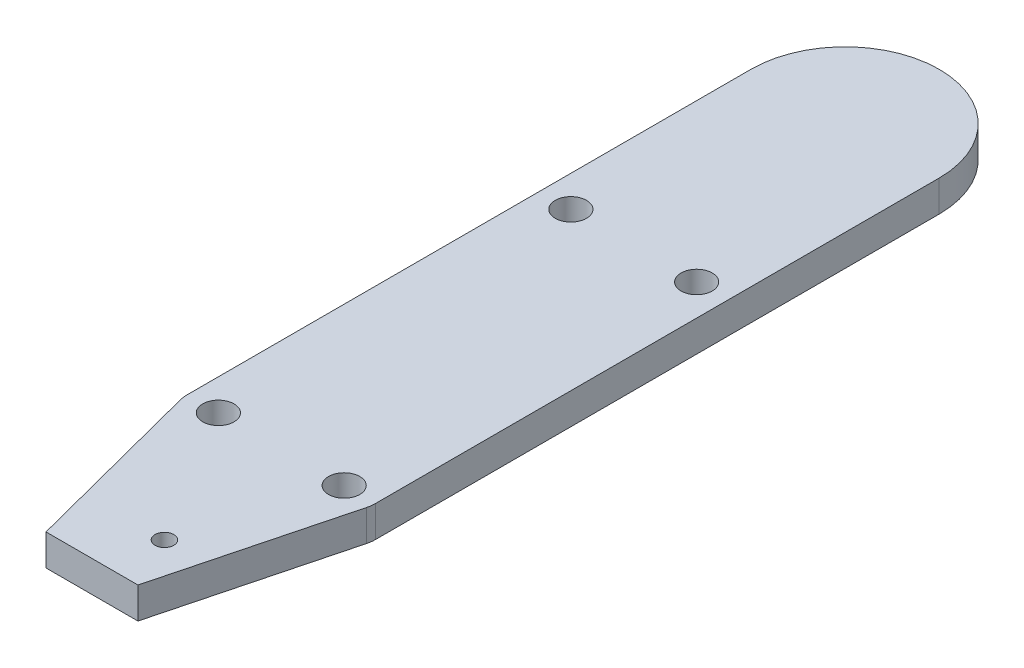
ISO-10303-21;
HEADER;
FILE_DESCRIPTION(('STEP AP214'),'2;1');
FILE_NAME('part.step','',(''),(''),'','','');
FILE_SCHEMA(('AUTOMOTIVE_DESIGN { 1 0 10303 214 1 1 1 1 }'));
ENDSEC;
DATA;
#1=APPLICATION_CONTEXT('core data for automotive mechanical design processes');
#2=APPLICATION_PROTOCOL_DEFINITION('international standard','automotive_design',2000,#1);
#3=PRODUCT_CONTEXT('',#1,'mechanical');
#4=PRODUCT('Part','Part','',(#3));
#5=PRODUCT_RELATED_PRODUCT_CATEGORY('part','',(#4));
#6=PRODUCT_DEFINITION_FORMATION('','',#4);
#7=PRODUCT_DEFINITION_CONTEXT('part definition',#1,'design');
#8=PRODUCT_DEFINITION('design','',#6,#7);
#9=PRODUCT_DEFINITION_SHAPE('','',#8);
#10=(LENGTH_UNIT() NAMED_UNIT(*) SI_UNIT(.MILLI.,.METRE.));
#11=(NAMED_UNIT(*) PLANE_ANGLE_UNIT() SI_UNIT($,.RADIAN.));
#12=(NAMED_UNIT(*) SI_UNIT($,.STERADIAN.) SOLID_ANGLE_UNIT());
#13=UNCERTAINTY_MEASURE_WITH_UNIT(LENGTH_MEASURE(1.E-05),#10,'distance_accuracy_value','');
#14=(GEOMETRIC_REPRESENTATION_CONTEXT(3) GLOBAL_UNCERTAINTY_ASSIGNED_CONTEXT((#13)) GLOBAL_UNIT_ASSIGNED_CONTEXT((#10,
#11,#12)) REPRESENTATION_CONTEXT('',''));
#15=CARTESIAN_POINT('',(0.,0.,0.));
#16=DIRECTION('',(0.,0.,1.));
#17=DIRECTION('',(1.,0.,0.));
#18=AXIS2_PLACEMENT_3D('',#15,#16,#17);
#19=CARTESIAN_POINT('',(25.1286787233292,5.,-29.7843357814116));
#20=DIRECTION('',(0.,1.,0.));
#21=DIRECTION('',(0.,0.,1.));
#22=AXIS2_PLACEMENT_3D('',#19,#20,#21);
#23=PLANE('',#22);
#24=CARTESIAN_POINT('',(18.2904507105765,5.,-7.86088897481757));
#25=DIRECTION('',(0.,1.,0.));
#26=DIRECTION('',(0.,0.,1.));
#27=AXIS2_PLACEMENT_3D('',#24,#25,#26);
#28=CIRCLE('',#27,1.49999999999999);
#29=CARTESIAN_POINT('',(18.2904507105765,5.,-6.36088897481759));
#30=VERTEX_POINT('',#29);
#31=EDGE_CURVE('E244',#30,#30,#28,.T.);
#32=ORIENTED_EDGE('',*,*,#31,.F.);
#33=EDGE_LOOP('',(#32));
#34=FACE_BOUND('',#33,.T.);
#35=CARTESIAN_POINT('',(25.1286787233292,5.,-86.1852971629522));
#36=DIRECTION('',(0.,1.,0.));
#37=DIRECTION('',(0.,0.,1.));
#38=AXIS2_PLACEMENT_3D('',#35,#36,#37);
#39=CIRCLE('',#38,2.5);
#40=CARTESIAN_POINT('',(25.1286787233292,5.,-83.6852971629522));
#41=VERTEX_POINT('',#40);
#42=EDGE_CURVE('E221',#41,#41,#39,.T.);
#43=ORIENTED_EDGE('',*,*,#42,.F.);
#44=EDGE_LOOP('',(#43));
#45=FACE_BOUND('',#44,.T.);
#46=CARTESIAN_POINT('',(25.1286787233292,5.,-29.7843357814116));
#47=DIRECTION('',(0.,1.,0.));
#48=DIRECTION('',(0.,0.,1.));
#49=AXIS2_PLACEMENT_3D('',#46,#47,#48);
#50=CIRCLE('',#49,2.5);
#51=CARTESIAN_POINT('',(25.1286787233292,5.,-27.2843357814116));
#52=VERTEX_POINT('',#51);
#53=EDGE_CURVE('E146',#52,#52,#50,.T.);
#54=ORIENTED_EDGE('',*,*,#53,.F.);
#55=EDGE_LOOP('',(#54));
#56=FACE_BOUND('',#55,.T.);
#57=CARTESIAN_POINT('',(25.1286787233292,5.,-29.7843357814116));
#58=DIRECTION('',(0.,1.,0.));
#59=DIRECTION('',(0.,0.,1.));
#60=AXIS2_PLACEMENT_3D('',#57,#58,#59);
#61=CIRCLE('',#60,5.);
#62=CARTESIAN_POINT('',(29.9678303191677,5.,-28.5263167702302));
#63=VERTEX_POINT('',#62);
#64=CARTESIAN_POINT('',(30.1286787233292,5.,-29.7843357814116));
#65=VERTEX_POINT('',#64);
#66=EDGE_CURVE('E164',#63,#65,#61,.T.);
#67=ORIENTED_EDGE('',*,*,#66,.T.);
#68=DIRECTION('',(0.,0.,-1.));
#69=VECTOR('',#68,1.);
#70=CARTESIAN_POINT('',(30.1286787233292,5.,-29.7843357814116));
#71=LINE('',#70,#69);
#72=CARTESIAN_POINT('',(30.1286787233292,5.,-120.));
#73=VERTEX_POINT('',#72);
#74=EDGE_CURVE('E100',#65,#73,#71,.T.);
#75=ORIENTED_EDGE('',*,*,#74,.T.);
#76=CARTESIAN_POINT('',(15.0643393616646,5.,-120.));
#77=DIRECTION('',(0.,1.,0.));
#78=DIRECTION('',(0.,0.,1.));
#79=AXIS2_PLACEMENT_3D('',#76,#77,#78);
#80=CIRCLE('',#79,15.0643393616646);
#81=CARTESIAN_POINT('',(0.,5.,-120.));
#82=VERTEX_POINT('',#81);
#83=EDGE_CURVE('E185',#73,#82,#80,.T.);
#84=ORIENTED_EDGE('',*,*,#83,.T.);
#85=DIRECTION('',(0.,0.,1.));
#86=VECTOR('',#85,1.);
#87=CARTESIAN_POINT('',(0.,5.,-29.7843357814116));
#88=LINE('',#87,#86);
#89=CARTESIAN_POINT('',(0.,5.,-29.7843357814116));
#90=VERTEX_POINT('',#89);
#91=EDGE_CURVE('E199',#82,#90,#88,.T.);
#92=ORIENTED_EDGE('',*,*,#91,.T.);
#93=CARTESIAN_POINT('',(5.,5.,-29.7843357814116));
#94=DIRECTION('',(0.,1.,0.));
#95=DIRECTION('',(0.,0.,-1.));
#96=AXIS2_PLACEMENT_3D('',#93,#94,#95);
#97=CIRCLE('',#96,5.);
#98=CARTESIAN_POINT('',(0.160848404161517,5.,-28.5263167702302));
#99=VERTEX_POINT('',#98);
#100=EDGE_CURVE('E119',#90,#99,#97,.T.);
#101=ORIENTED_EDGE('',*,*,#100,.T.);
#102=DIRECTION('',(0.251603802236282,0.,0.967830319167697));
#103=VECTOR('',#102,1.);
#104=CARTESIAN_POINT('',(7.70756249766832,5.,0.503207604472564));
#105=LINE('',#104,#103);
#106=CARTESIAN_POINT('',(7.70756249766832,5.,0.503207604472564));
#107=VERTEX_POINT('',#106);
#108=EDGE_CURVE('E113',#99,#107,#105,.T.);
#109=ORIENTED_EDGE('',*,*,#108,.T.);
#110=DIRECTION('',(1.,0.,0.));
#111=VECTOR('',#110,1.);
#112=CARTESIAN_POINT('',(7.70756249766832,5.,0.503207604472564));
#113=LINE('',#112,#111);
#114=CARTESIAN_POINT('',(22.4211162256609,5.,0.503207604472564));
#115=VERTEX_POINT('',#114);
#116=EDGE_CURVE('E117',#107,#115,#113,.T.);
#117=ORIENTED_EDGE('',*,*,#116,.T.);
#118=DIRECTION('',(0.251603802236282,0.,-0.967830319167697));
#119=VECTOR('',#118,1.);
#120=CARTESIAN_POINT('',(22.4211162256609,5.,0.503207604472564));
#121=LINE('',#120,#119);
#122=EDGE_CURVE('E57',#115,#63,#121,.T.);
#123=ORIENTED_EDGE('',*,*,#122,.T.);
#124=EDGE_LOOP('',(#67,#75,#84,#92,#101,#109,#117,#123));
#125=FACE_BOUND('',#124,.T.);
#126=CARTESIAN_POINT('',(5.,5.,-29.7843357814116));
#127=DIRECTION('',(0.,1.,0.));
#128=DIRECTION('',(0.,0.,1.));
#129=AXIS2_PLACEMENT_3D('',#126,#127,#128);
#130=CIRCLE('',#129,2.5);
#131=CARTESIAN_POINT('',(5.,5.,-27.2843357814116));
#132=VERTEX_POINT('',#131);
#133=EDGE_CURVE('E213',#132,#132,#130,.T.);
#134=ORIENTED_EDGE('',*,*,#133,.F.);
#135=EDGE_LOOP('',(#134));
#136=FACE_BOUND('',#135,.T.);
#137=CARTESIAN_POINT('',(5.,5.,-86.1852971629522));
#138=DIRECTION('',(0.,1.,0.));
#139=DIRECTION('',(0.,0.,1.));
#140=AXIS2_PLACEMENT_3D('',#137,#138,#139);
#141=CIRCLE('',#140,2.5);
#142=CARTESIAN_POINT('',(5.,5.,-83.6852971629522));
#143=VERTEX_POINT('',#142);
#144=EDGE_CURVE('E229',#143,#143,#141,.T.);
#145=ORIENTED_EDGE('',*,*,#144,.F.);
#146=EDGE_LOOP('',(#145));
#147=FACE_BOUND('',#146,.T.);
#148=ADVANCED_FACE('F39',(#34,#45,#56,#125,#136,#147),#23,.T.);
#149=CARTESIAN_POINT('',(25.1286787233292,0.,-29.7843357814116));
#150=DIRECTION('',(0.,1.,0.));
#151=DIRECTION('',(0.,0.,1.));
#152=AXIS2_PLACEMENT_3D('',#149,#150,#151);
#153=PLANE('',#152);
#154=CARTESIAN_POINT('',(18.2904507105765,0.,-7.86088897481757));
#155=DIRECTION('',(0.,1.,0.));
#156=DIRECTION('',(0.,0.,1.));
#157=AXIS2_PLACEMENT_3D('',#154,#155,#156);
#158=CIRCLE('',#157,1.5);
#159=CARTESIAN_POINT('',(18.2904507105765,0.,-6.36088897481758));
#160=VERTEX_POINT('',#159);
#161=EDGE_CURVE('E237',#160,#160,#158,.T.);
#162=ORIENTED_EDGE('',*,*,#161,.T.);
#163=EDGE_LOOP('',(#162));
#164=FACE_BOUND('',#163,.T.);
#165=CARTESIAN_POINT('',(25.1286787233292,0.,-29.7843357814116));
#166=DIRECTION('',(0.,1.,0.));
#167=DIRECTION('',(0.,0.,1.));
#168=AXIS2_PLACEMENT_3D('',#165,#166,#167);
#169=CIRCLE('',#168,5.);
#170=CARTESIAN_POINT('',(29.9678303191677,0.,-28.5263167702302));
#171=VERTEX_POINT('',#170);
#172=CARTESIAN_POINT('',(30.1286787233292,0.,-29.7843357814116));
#173=VERTEX_POINT('',#172);
#174=EDGE_CURVE('E141',#171,#173,#169,.T.);
#175=ORIENTED_EDGE('',*,*,#174,.F.);
#176=DIRECTION('',(0.251603802236282,0.,-0.967830319167697));
#177=VECTOR('',#176,1.);
#178=CARTESIAN_POINT('',(22.4211162256609,0.,0.503207604472564));
#179=LINE('',#178,#177);
#180=CARTESIAN_POINT('',(22.4211162256609,0.,0.503207604472564));
#181=VERTEX_POINT('',#180);
#182=EDGE_CURVE('E92',#181,#171,#179,.T.);
#183=ORIENTED_EDGE('',*,*,#182,.F.);
#184=DIRECTION('',(1.,0.,0.));
#185=VECTOR('',#184,1.);
#186=CARTESIAN_POINT('',(7.70756249766832,0.,0.503207604472564));
#187=LINE('',#186,#185);
#188=CARTESIAN_POINT('',(7.70756249766832,0.,0.503207604472564));
#189=VERTEX_POINT('',#188);
#190=EDGE_CURVE('E86',#189,#181,#187,.T.);
#191=ORIENTED_EDGE('',*,*,#190,.F.);
#192=DIRECTION('',(0.251603802236282,0.,0.967830319167697));
#193=VECTOR('',#192,1.);
#194=CARTESIAN_POINT('',(7.70756249766832,0.,0.503207604472564));
#195=LINE('',#194,#193);
#196=CARTESIAN_POINT('',(0.160848404161517,0.,-28.5263167702302));
#197=VERTEX_POINT('',#196);
#198=EDGE_CURVE('E128',#197,#189,#195,.T.);
#199=ORIENTED_EDGE('',*,*,#198,.F.);
#200=CARTESIAN_POINT('',(5.,0.,-29.7843357814116));
#201=DIRECTION('',(0.,1.,0.));
#202=DIRECTION('',(0.,0.,-1.));
#203=AXIS2_PLACEMENT_3D('',#200,#201,#202);
#204=CIRCLE('',#203,5.);
#205=CARTESIAN_POINT('',(0.,0.,-29.7843357814116));
#206=VERTEX_POINT('',#205);
#207=EDGE_CURVE('E155',#206,#197,#204,.T.);
#208=ORIENTED_EDGE('',*,*,#207,.F.);
#209=DIRECTION('',(0.,0.,1.));
#210=VECTOR('',#209,1.);
#211=CARTESIAN_POINT('',(0.,0.,-29.7843357814116));
#212=LINE('',#211,#210);
#213=CARTESIAN_POINT('',(0.,0.,-120.));
#214=VERTEX_POINT('',#213);
#215=EDGE_CURVE('E152',#214,#206,#212,.T.);
#216=ORIENTED_EDGE('',*,*,#215,.F.);
#217=CARTESIAN_POINT('',(15.0643393616646,0.,-120.));
#218=DIRECTION('',(0.,1.,0.));
#219=DIRECTION('',(0.,0.,1.));
#220=AXIS2_PLACEMENT_3D('',#217,#218,#219);
#221=CIRCLE('',#220,15.0643393616646);
#222=CARTESIAN_POINT('',(30.1286787233292,0.,-120.));
#223=VERTEX_POINT('',#222);
#224=EDGE_CURVE('E149',#223,#214,#221,.T.);
#225=ORIENTED_EDGE('',*,*,#224,.F.);
#226=DIRECTION('',(0.,0.,-1.));
#227=VECTOR('',#226,1.);
#228=CARTESIAN_POINT('',(30.1286787233292,0.,-29.7843357814116));
#229=LINE('',#228,#227);
#230=EDGE_CURVE('E145',#173,#223,#229,.T.);
#231=ORIENTED_EDGE('',*,*,#230,.F.);
#232=EDGE_LOOP('',(#175,#183,#191,#199,#208,#216,#225,#231));
#233=FACE_BOUND('',#232,.T.);
#234=CARTESIAN_POINT('',(25.1286787233292,0.,-29.7843357814116));
#235=DIRECTION('',(0.,1.,0.));
#236=DIRECTION('',(0.,0.,1.));
#237=AXIS2_PLACEMENT_3D('',#234,#235,#236);
#238=CIRCLE('',#237,2.5);
#239=CARTESIAN_POINT('',(25.1286787233292,0.,-27.2843357814116));
#240=VERTEX_POINT('',#239);
#241=EDGE_CURVE('E209',#240,#240,#238,.T.);
#242=ORIENTED_EDGE('',*,*,#241,.T.);
#243=EDGE_LOOP('',(#242));
#244=FACE_BOUND('',#243,.T.);
#245=CARTESIAN_POINT('',(5.,0.,-29.7843357814116));
#246=DIRECTION('',(0.,1.,0.));
#247=DIRECTION('',(0.,0.,1.));
#248=AXIS2_PLACEMENT_3D('',#245,#246,#247);
#249=CIRCLE('',#248,2.5);
#250=CARTESIAN_POINT('',(5.,0.,-27.2843357814116));
#251=VERTEX_POINT('',#250);
#252=EDGE_CURVE('E217',#251,#251,#249,.T.);
#253=ORIENTED_EDGE('',*,*,#252,.T.);
#254=EDGE_LOOP('',(#253));
#255=FACE_BOUND('',#254,.T.);
#256=CARTESIAN_POINT('',(25.1286787233292,0.,-86.1852971629522));
#257=DIRECTION('',(0.,1.,0.));
#258=DIRECTION('',(0.,0.,1.));
#259=AXIS2_PLACEMENT_3D('',#256,#257,#258);
#260=CIRCLE('',#259,2.5);
#261=CARTESIAN_POINT('',(25.1286787233292,0.,-83.6852971629522));
#262=VERTEX_POINT('',#261);
#263=EDGE_CURVE('E225',#262,#262,#260,.T.);
#264=ORIENTED_EDGE('',*,*,#263,.T.);
#265=EDGE_LOOP('',(#264));
#266=FACE_BOUND('',#265,.T.);
#267=CARTESIAN_POINT('',(5.,0.,-86.1852971629522));
#268=DIRECTION('',(0.,1.,0.));
#269=DIRECTION('',(0.,0.,1.));
#270=AXIS2_PLACEMENT_3D('',#267,#268,#269);
#271=CIRCLE('',#270,2.5);
#272=CARTESIAN_POINT('',(5.,0.,-83.6852971629522));
#273=VERTEX_POINT('',#272);
#274=EDGE_CURVE('E233',#273,#273,#271,.T.);
#275=ORIENTED_EDGE('',*,*,#274,.T.);
#276=EDGE_LOOP('',(#275));
#277=FACE_BOUND('',#276,.T.);
#278=ADVANCED_FACE('F189',(#164,#233,#244,#255,#266,#277),#153,.F.);
#279=CARTESIAN_POINT('',(25.1286787233292,5.,-29.7843357814116));
#280=DIRECTION('',(0.,-1.,0.));
#281=DIRECTION('',(0.,0.,-1.));
#282=AXIS2_PLACEMENT_3D('',#279,#280,#281);
#283=CYLINDRICAL_SURFACE('',#282,5.);
#284=ORIENTED_EDGE('',*,*,#174,.T.);
#285=DIRECTION('',(0.,-1.,0.));
#286=VECTOR('',#285,1.);
#287=CARTESIAN_POINT('',(30.1286787233292,5.,-29.7843357814116));
#288=LINE('',#287,#286);
#289=EDGE_CURVE('E11',#65,#173,#288,.T.);
#290=ORIENTED_EDGE('',*,*,#289,.F.);
#291=ORIENTED_EDGE('',*,*,#66,.F.);
#292=DIRECTION('',(0.,-1.,0.));
#293=VECTOR('',#292,1.);
#294=CARTESIAN_POINT('',(29.9678303191677,5.,-28.5263167702302));
#295=LINE('',#294,#293);
#296=EDGE_CURVE('E137',#63,#171,#295,.T.);
#297=ORIENTED_EDGE('',*,*,#296,.T.);
#298=EDGE_LOOP('',(#284,#290,#291,#297));
#299=FACE_BOUND('',#298,.T.);
#300=ADVANCED_FACE('F41',(#299),#283,.T.);
#301=CARTESIAN_POINT('',(30.1286787233292,5.,-29.7843357814116));
#302=DIRECTION('',(-1.,0.,0.));
#303=DIRECTION('',(0.,0.,1.));
#304=AXIS2_PLACEMENT_3D('',#301,#302,#303);
#305=PLANE('',#304);
#306=ORIENTED_EDGE('',*,*,#230,.T.);
#307=DIRECTION('',(0.,-1.,0.));
#308=VECTOR('',#307,1.);
#309=CARTESIAN_POINT('',(30.1286787233292,5.,-120.));
#310=LINE('',#309,#308);
#311=EDGE_CURVE('E49',#73,#223,#310,.T.);
#312=ORIENTED_EDGE('',*,*,#311,.F.);
#313=ORIENTED_EDGE('',*,*,#74,.F.);
#314=ORIENTED_EDGE('',*,*,#289,.T.);
#315=EDGE_LOOP('',(#306,#312,#313,#314));
#316=FACE_BOUND('',#315,.T.);
#317=ADVANCED_FACE('F303',(#316),#305,.F.);
#318=CARTESIAN_POINT('',(15.0643393616646,5.,-120.));
#319=DIRECTION('',(0.,-1.,0.));
#320=DIRECTION('',(0.,0.,-1.));
#321=AXIS2_PLACEMENT_3D('',#318,#319,#320);
#322=CYLINDRICAL_SURFACE('',#321,15.0643393616646);
#323=ORIENTED_EDGE('',*,*,#224,.T.);
#324=DIRECTION('',(0.,-1.,0.));
#325=VECTOR('',#324,1.);
#326=CARTESIAN_POINT('',(0.,5.,-120.));
#327=LINE('',#326,#325);
#328=EDGE_CURVE('E175',#82,#214,#327,.T.);
#329=ORIENTED_EDGE('',*,*,#328,.F.);
#330=ORIENTED_EDGE('',*,*,#83,.F.);
#331=ORIENTED_EDGE('',*,*,#311,.T.);
#332=EDGE_LOOP('',(#323,#329,#330,#331));
#333=FACE_BOUND('',#332,.T.);
#334=ADVANCED_FACE('F183',(#333),#322,.T.);
#335=CARTESIAN_POINT('',(0.,5.,-29.7843357814116));
#336=DIRECTION('',(1.,0.,0.));
#337=DIRECTION('',(0.,0.,-1.));
#338=AXIS2_PLACEMENT_3D('',#335,#336,#337);
#339=PLANE('',#338);
#340=ORIENTED_EDGE('',*,*,#215,.T.);
#341=DIRECTION('',(0.,-1.,0.));
#342=VECTOR('',#341,1.);
#343=CARTESIAN_POINT('',(0.,5.,-29.7843357814116));
#344=LINE('',#343,#342);
#345=EDGE_CURVE('E171',#90,#206,#344,.T.);
#346=ORIENTED_EDGE('',*,*,#345,.F.);
#347=ORIENTED_EDGE('',*,*,#91,.F.);
#348=ORIENTED_EDGE('',*,*,#328,.T.);
#349=EDGE_LOOP('',(#340,#346,#347,#348));
#350=FACE_BOUND('',#349,.T.);
#351=ADVANCED_FACE('F194',(#350),#339,.F.);
#352=CARTESIAN_POINT('',(5.,5.,-29.7843357814116));
#353=DIRECTION('',(0.,-1.,0.));
#354=DIRECTION('',(0.,0.,-1.));
#355=AXIS2_PLACEMENT_3D('',#352,#353,#354);
#356=CYLINDRICAL_SURFACE('',#355,5.);
#357=ORIENTED_EDGE('',*,*,#207,.T.);
#358=DIRECTION('',(0.,-1.,0.));
#359=VECTOR('',#358,1.);
#360=CARTESIAN_POINT('',(0.160848404161517,5.,-28.5263167702302));
#361=LINE('',#360,#359);
#362=EDGE_CURVE('E130',#99,#197,#361,.T.);
#363=ORIENTED_EDGE('',*,*,#362,.F.);
#364=ORIENTED_EDGE('',*,*,#100,.F.);
#365=ORIENTED_EDGE('',*,*,#345,.T.);
#366=EDGE_LOOP('',(#357,#363,#364,#365));
#367=FACE_BOUND('',#366,.T.);
#368=ADVANCED_FACE('F197',(#367),#356,.T.);
#369=CARTESIAN_POINT('',(7.70756249766832,5.,0.503207604472564));
#370=DIRECTION('',(0.967830319167697,0.,-0.251603802236282));
#371=DIRECTION('',(-0.251603802236282,0.,-0.967830319167697));
#372=AXIS2_PLACEMENT_3D('',#369,#370,#371);
#373=PLANE('',#372);
#374=ORIENTED_EDGE('',*,*,#198,.T.);
#375=DIRECTION('',(0.,-1.,0.));
#376=VECTOR('',#375,1.);
#377=CARTESIAN_POINT('',(7.70756249766832,5.,0.503207604472564));
#378=LINE('',#377,#376);
#379=EDGE_CURVE('E125',#107,#189,#378,.T.);
#380=ORIENTED_EDGE('',*,*,#379,.F.);
#381=ORIENTED_EDGE('',*,*,#108,.F.);
#382=ORIENTED_EDGE('',*,*,#362,.T.);
#383=EDGE_LOOP('',(#374,#380,#381,#382));
#384=FACE_BOUND('',#383,.T.);
#385=ADVANCED_FACE('F126',(#384),#373,.F.);
#386=CARTESIAN_POINT('',(7.70756249766832,5.,0.503207604472564));
#387=DIRECTION('',(0.,0.,-1.));
#388=DIRECTION('',(-1.,0.,0.));
#389=AXIS2_PLACEMENT_3D('',#386,#387,#388);
#390=PLANE('',#389);
#391=ORIENTED_EDGE('',*,*,#190,.T.);
#392=DIRECTION('',(0.,-1.,0.));
#393=VECTOR('',#392,1.);
#394=CARTESIAN_POINT('',(22.4211162256609,5.,0.503207604472564));
#395=LINE('',#394,#393);
#396=EDGE_CURVE('E131',#115,#181,#395,.T.);
#397=ORIENTED_EDGE('',*,*,#396,.F.);
#398=ORIENTED_EDGE('',*,*,#116,.F.);
#399=ORIENTED_EDGE('',*,*,#379,.T.);
#400=EDGE_LOOP('',(#391,#397,#398,#399));
#401=FACE_BOUND('',#400,.T.);
#402=ADVANCED_FACE('F133',(#401),#390,.F.);
#403=CARTESIAN_POINT('',(22.4211162256609,5.,0.503207604472564));
#404=DIRECTION('',(-0.967830319167697,0.,-0.251603802236282));
#405=DIRECTION('',(-0.251603802236282,0.,0.967830319167697));
#406=AXIS2_PLACEMENT_3D('',#403,#404,#405);
#407=PLANE('',#406);
#408=ORIENTED_EDGE('',*,*,#182,.T.);
#409=ORIENTED_EDGE('',*,*,#296,.F.);
#410=ORIENTED_EDGE('',*,*,#122,.F.);
#411=ORIENTED_EDGE('',*,*,#396,.T.);
#412=EDGE_LOOP('',(#408,#409,#410,#411));
#413=FACE_BOUND('',#412,.T.);
#414=ADVANCED_FACE('F262',(#413),#407,.F.);
#415=CARTESIAN_POINT('',(25.1286787233292,5.,-29.7843357814116));
#416=DIRECTION('',(0.,-1.,0.));
#417=DIRECTION('',(0.,0.,-1.));
#418=AXIS2_PLACEMENT_3D('',#415,#416,#417);
#419=CYLINDRICAL_SURFACE('',#418,2.5);
#420=ORIENTED_EDGE('',*,*,#53,.T.);
#421=EDGE_LOOP('',(#420));
#422=FACE_BOUND('',#421,.T.);
#423=ORIENTED_EDGE('',*,*,#241,.F.);
#424=EDGE_LOOP('',(#423));
#425=FACE_BOUND('',#424,.T.);
#426=ADVANCED_FACE('F258',(#422,#425),#419,.F.);
#427=CARTESIAN_POINT('',(5.,5.,-29.7843357814116));
#428=DIRECTION('',(0.,-1.,0.));
#429=DIRECTION('',(0.,0.,-1.));
#430=AXIS2_PLACEMENT_3D('',#427,#428,#429);
#431=CYLINDRICAL_SURFACE('',#430,2.5);
#432=ORIENTED_EDGE('',*,*,#133,.T.);
#433=EDGE_LOOP('',(#432));
#434=FACE_BOUND('',#433,.T.);
#435=ORIENTED_EDGE('',*,*,#252,.F.);
#436=EDGE_LOOP('',(#435));
#437=FACE_BOUND('',#436,.T.);
#438=ADVANCED_FACE('F261',(#434,#437),#431,.F.);
#439=CARTESIAN_POINT('',(25.1286787233292,5.,-86.1852971629522));
#440=DIRECTION('',(0.,-1.,0.));
#441=DIRECTION('',(0.,0.,-1.));
#442=AXIS2_PLACEMENT_3D('',#439,#440,#441);
#443=CYLINDRICAL_SURFACE('',#442,2.5);
#444=ORIENTED_EDGE('',*,*,#42,.T.);
#445=EDGE_LOOP('',(#444));
#446=FACE_BOUND('',#445,.T.);
#447=ORIENTED_EDGE('',*,*,#263,.F.);
#448=EDGE_LOOP('',(#447));
#449=FACE_BOUND('',#448,.T.);
#450=ADVANCED_FACE('F277',(#446,#449),#443,.F.);
#451=CARTESIAN_POINT('',(5.,5.,-86.1852971629522));
#452=DIRECTION('',(0.,-1.,0.));
#453=DIRECTION('',(0.,0.,-1.));
#454=AXIS2_PLACEMENT_3D('',#451,#452,#453);
#455=CYLINDRICAL_SURFACE('',#454,2.5);
#456=ORIENTED_EDGE('',*,*,#144,.T.);
#457=EDGE_LOOP('',(#456));
#458=FACE_BOUND('',#457,.T.);
#459=ORIENTED_EDGE('',*,*,#274,.F.);
#460=EDGE_LOOP('',(#459));
#461=FACE_BOUND('',#460,.T.);
#462=ADVANCED_FACE('F275',(#458,#461),#455,.F.);
#463=CARTESIAN_POINT('',(18.2904507105765,5.,-7.86088897481757));
#464=DIRECTION('',(0.,1.,0.));
#465=DIRECTION('',(0.,0.,1.));
#466=AXIS2_PLACEMENT_3D('',#463,#464,#465);
#467=CYLINDRICAL_SURFACE('',#466,1.49999999999999);
#468=ORIENTED_EDGE('',*,*,#161,.F.);
#469=EDGE_LOOP('',(#468));
#470=FACE_BOUND('',#469,.T.);
#471=ORIENTED_EDGE('',*,*,#31,.T.);
#472=EDGE_LOOP('',(#471));
#473=FACE_BOUND('',#472,.T.);
#474=ADVANCED_FACE('F249',(#470,#473),#467,.F.);
#475=CLOSED_SHELL('',(#148,#278,#300,#317,#334,#351,#368,#385,#402,#414,#426,#438,#450,#462,#474));
#476=MANIFOLD_SOLID_BREP('B2',#475);
#477=ADVANCED_BREP_SHAPE_REPRESENTATION('',(#18,#476),#14);
#478=SHAPE_DEFINITION_REPRESENTATION(#9,#477);
ENDSEC;
END-ISO-10303-21;
